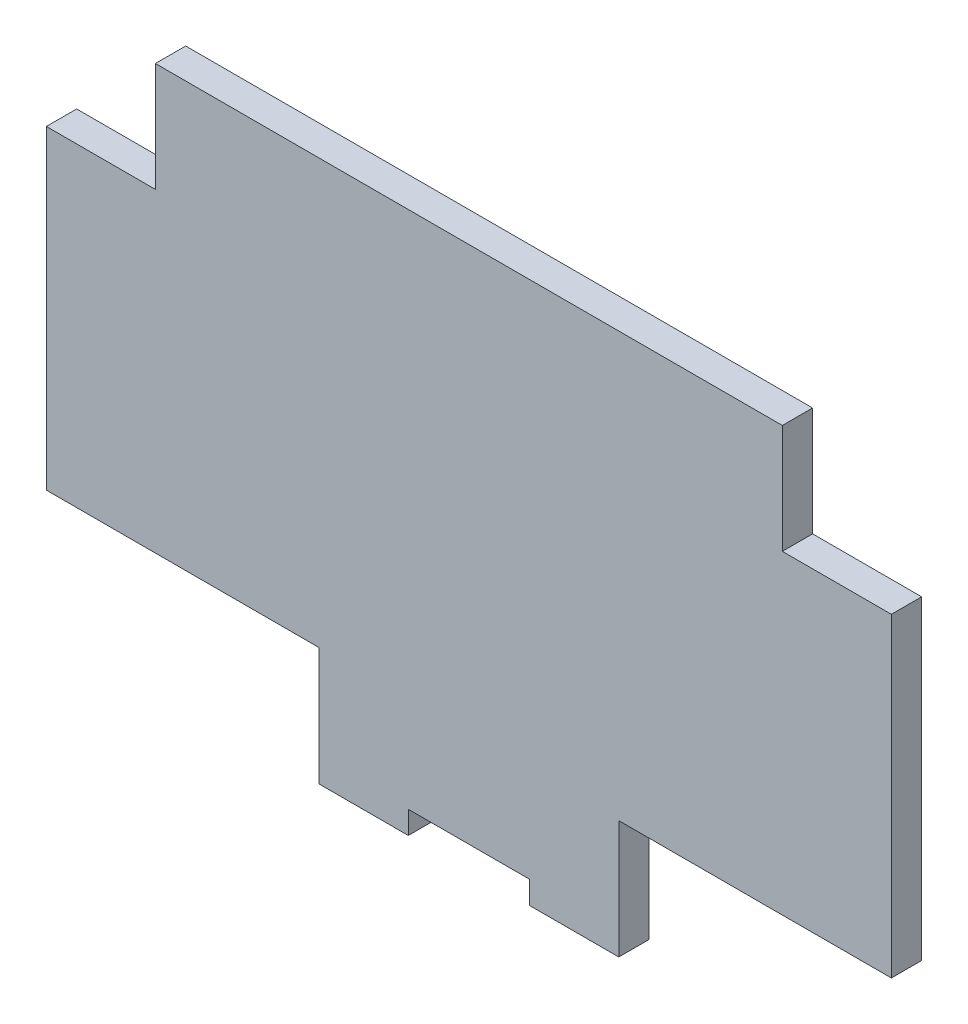
ISO-10303-21;
HEADER;
FILE_DESCRIPTION(('STEP AP214'),'2;1');
FILE_NAME('part.step','',(''),(''),'','','');
FILE_SCHEMA(('AUTOMOTIVE_DESIGN { 1 0 10303 214 1 1 1 1 }'));
ENDSEC;
DATA;
#1=APPLICATION_CONTEXT('core data for automotive mechanical design processes');
#2=APPLICATION_PROTOCOL_DEFINITION('international standard','automotive_design',2000,#1);
#3=PRODUCT_CONTEXT('',#1,'mechanical');
#4=PRODUCT('Part','Part','',(#3));
#5=PRODUCT_RELATED_PRODUCT_CATEGORY('part','',(#4));
#6=PRODUCT_DEFINITION_FORMATION('','',#4);
#7=PRODUCT_DEFINITION_CONTEXT('part definition',#1,'design');
#8=PRODUCT_DEFINITION('design','',#6,#7);
#9=PRODUCT_DEFINITION_SHAPE('','',#8);
#10=(LENGTH_UNIT() NAMED_UNIT(*) SI_UNIT(.MILLI.,.METRE.));
#11=(NAMED_UNIT(*) PLANE_ANGLE_UNIT() SI_UNIT($,.RADIAN.));
#12=(NAMED_UNIT(*) SI_UNIT($,.STERADIAN.) SOLID_ANGLE_UNIT());
#13=UNCERTAINTY_MEASURE_WITH_UNIT(LENGTH_MEASURE(1.E-05),#10,'distance_accuracy_value','');
#14=(GEOMETRIC_REPRESENTATION_CONTEXT(3) GLOBAL_UNCERTAINTY_ASSIGNED_CONTEXT((#13)) GLOBAL_UNIT_ASSIGNED_CONTEXT((#10,
#11,#12)) REPRESENTATION_CONTEXT('',''));
#15=CARTESIAN_POINT('',(0.,0.,0.));
#16=DIRECTION('',(0.,0.,1.));
#17=DIRECTION('',(1.,0.,0.));
#18=AXIS2_PLACEMENT_3D('',#15,#16,#17);
#19=CARTESIAN_POINT('',(0.,0.,-2.));
#20=DIRECTION('',(0.,0.,1.));
#21=DIRECTION('',(1.,0.,0.));
#22=AXIS2_PLACEMENT_3D('',#19,#20,#21);
#23=PLANE('',#22);
#24=DIRECTION('',(1.,0.,0.));
#25=VECTOR('',#24,1.);
#26=CARTESIAN_POINT('',(0.,-17.9,-2.));
#27=LINE('',#26,#25);
#28=CARTESIAN_POINT('',(4.,-17.9,-2.));
#29=VERTEX_POINT('',#28);
#30=CARTESIAN_POINT('',(9.89999999999998,-17.9,-2.));
#31=VERTEX_POINT('',#30);
#32=EDGE_CURVE('E203',#29,#31,#27,.T.);
#33=ORIENTED_EDGE('',*,*,#32,.F.);
#34=DIRECTION('',(0.,1.,0.));
#35=VECTOR('',#34,1.);
#36=CARTESIAN_POINT('',(4.,0.,-2.));
#37=LINE('',#36,#35);
#38=CARTESIAN_POINT('',(4.,-16.4,-2.));
#39=VERTEX_POINT('',#38);
#40=EDGE_CURVE('E247',#29,#39,#37,.T.);
#41=ORIENTED_EDGE('',*,*,#40,.T.);
#42=DIRECTION('',(1.,0.,0.));
#43=VECTOR('',#42,1.);
#44=CARTESIAN_POINT('',(0.,-16.4,-2.));
#45=LINE('',#44,#43);
#46=CARTESIAN_POINT('',(-4.,-16.4,-2.));
#47=VERTEX_POINT('',#46);
#48=EDGE_CURVE('E244',#47,#39,#45,.T.);
#49=ORIENTED_EDGE('',*,*,#48,.F.);
#50=DIRECTION('',(0.,1.,0.));
#51=VECTOR('',#50,1.);
#52=CARTESIAN_POINT('',(-4.,0.,-2.));
#53=LINE('',#52,#51);
#54=CARTESIAN_POINT('',(-4.,-17.9,-2.));
#55=VERTEX_POINT('',#54);
#56=EDGE_CURVE('E241',#55,#47,#53,.T.);
#57=ORIENTED_EDGE('',*,*,#56,.F.);
#58=CARTESIAN_POINT('',(-9.90000000000001,-17.9,-2.));
#59=VERTEX_POINT('',#58);
#60=EDGE_CURVE('E208',#59,#55,#27,.T.);
#61=ORIENTED_EDGE('',*,*,#60,.F.);
#62=DIRECTION('',(0.,-1.,0.));
#63=VECTOR('',#62,1.);
#64=CARTESIAN_POINT('',(-9.90000000000001,0.,-2.));
#65=LINE('',#64,#63);
#66=CARTESIAN_POINT('',(-9.90000000000001,-10.1,-2.));
#67=VERTEX_POINT('',#66);
#68=EDGE_CURVE('E238',#67,#59,#65,.T.);
#69=ORIENTED_EDGE('',*,*,#68,.F.);
#70=DIRECTION('',(1.,0.,0.));
#71=VECTOR('',#70,1.);
#72=CARTESIAN_POINT('',(0.,-10.1,-2.));
#73=LINE('',#72,#71);
#74=CARTESIAN_POINT('',(-27.9,-10.1,-2.));
#75=VERTEX_POINT('',#74);
#76=EDGE_CURVE('E235',#75,#67,#73,.T.);
#77=ORIENTED_EDGE('',*,*,#76,.F.);
#78=DIRECTION('',(0.,-1.,0.));
#79=VECTOR('',#78,1.);
#80=CARTESIAN_POINT('',(-27.9,0.,-2.));
#81=LINE('',#80,#79);
#82=CARTESIAN_POINT('',(-27.9,10.7,-2.));
#83=VERTEX_POINT('',#82);
#84=EDGE_CURVE('E232',#83,#75,#81,.T.);
#85=ORIENTED_EDGE('',*,*,#84,.F.);
#86=DIRECTION('',(-1.,0.,0.));
#87=VECTOR('',#86,1.);
#88=CARTESIAN_POINT('',(0.,10.7,-2.));
#89=LINE('',#88,#87);
#90=CARTESIAN_POINT('',(-20.7,10.7,-2.));
#91=VERTEX_POINT('',#90);
#92=EDGE_CURVE('E229',#91,#83,#89,.T.);
#93=ORIENTED_EDGE('',*,*,#92,.F.);
#94=DIRECTION('',(0.,-1.,0.));
#95=VECTOR('',#94,1.);
#96=CARTESIAN_POINT('',(-20.7,0.,-2.));
#97=LINE('',#96,#95);
#98=CARTESIAN_POINT('',(-20.7,17.9,-2.));
#99=VERTEX_POINT('',#98);
#100=EDGE_CURVE('E226',#99,#91,#97,.T.);
#101=ORIENTED_EDGE('',*,*,#100,.F.);
#102=DIRECTION('',(-1.,0.,0.));
#103=VECTOR('',#102,1.);
#104=CARTESIAN_POINT('',(0.,17.9,-2.));
#105=LINE('',#104,#103);
#106=CARTESIAN_POINT('',(20.7,17.9,-2.));
#107=VERTEX_POINT('',#106);
#108=EDGE_CURVE('E223',#107,#99,#105,.T.);
#109=ORIENTED_EDGE('',*,*,#108,.F.);
#110=DIRECTION('',(0.,1.,0.));
#111=VECTOR('',#110,1.);
#112=CARTESIAN_POINT('',(20.7,0.,-2.));
#113=LINE('',#112,#111);
#114=CARTESIAN_POINT('',(20.7,10.7,-2.));
#115=VERTEX_POINT('',#114);
#116=EDGE_CURVE('E220',#115,#107,#113,.T.);
#117=ORIENTED_EDGE('',*,*,#116,.F.);
#118=DIRECTION('',(-1.,0.,0.));
#119=VECTOR('',#118,1.);
#120=CARTESIAN_POINT('',(0.,10.7,-2.));
#121=LINE('',#120,#119);
#122=CARTESIAN_POINT('',(27.9,10.7,-2.));
#123=VERTEX_POINT('',#122);
#124=EDGE_CURVE('E217',#123,#115,#121,.T.);
#125=ORIENTED_EDGE('',*,*,#124,.F.);
#126=DIRECTION('',(0.,1.,0.));
#127=VECTOR('',#126,1.);
#128=CARTESIAN_POINT('',(27.9,0.,-2.));
#129=LINE('',#128,#127);
#130=CARTESIAN_POINT('',(27.9,-10.1,-2.));
#131=VERTEX_POINT('',#130);
#132=EDGE_CURVE('E214',#131,#123,#129,.T.);
#133=ORIENTED_EDGE('',*,*,#132,.F.);
#134=DIRECTION('',(1.,0.,0.));
#135=VECTOR('',#134,1.);
#136=CARTESIAN_POINT('',(0.,-10.1,-2.));
#137=LINE('',#136,#135);
#138=CARTESIAN_POINT('',(9.89999999999998,-10.1,-2.));
#139=VERTEX_POINT('',#138);
#140=EDGE_CURVE('E211',#139,#131,#137,.T.);
#141=ORIENTED_EDGE('',*,*,#140,.F.);
#142=DIRECTION('',(0.,1.,0.));
#143=VECTOR('',#142,1.);
#144=CARTESIAN_POINT('',(9.89999999999999,0.,-2.));
#145=LINE('',#144,#143);
#146=EDGE_CURVE('E206',#31,#139,#145,.T.);
#147=ORIENTED_EDGE('',*,*,#146,.F.);
#148=EDGE_LOOP('',(#33,#41,#49,#57,#61,#69,#77,#85,#93,#101,#109,#117,#125,#133,#141,#147));
#149=FACE_BOUND('',#148,.T.);
#150=DIRECTION('',(0.,1.,0.));
#151=VECTOR('',#150,1.);
#152=CARTESIAN_POINT('',(-20.,-8.2,-2.));
#153=LINE('',#152,#151);
#154=CARTESIAN_POINT('',(-20.,-8.2,-2.));
#155=VERTEX_POINT('',#154);
#156=CARTESIAN_POINT('',(-20.,4.8,-2.));
#157=VERTEX_POINT('',#156);
#158=EDGE_CURVE('E52',#155,#157,#153,.T.);
#159=ORIENTED_EDGE('',*,*,#158,.F.);
#160=DIRECTION('',(-1.,0.,0.));
#161=VECTOR('',#160,1.);
#162=CARTESIAN_POINT('',(20.,-8.2,-2.));
#163=LINE('',#162,#161);
#164=CARTESIAN_POINT('',(20.,-8.2,-2.));
#165=VERTEX_POINT('',#164);
#166=EDGE_CURVE('E56',#165,#155,#163,.T.);
#167=ORIENTED_EDGE('',*,*,#166,.F.);
#168=DIRECTION('',(0.,-1.,0.));
#169=VECTOR('',#168,1.);
#170=CARTESIAN_POINT('',(20.,-8.2,-2.));
#171=LINE('',#170,#169);
#172=CARTESIAN_POINT('',(20.,4.8,-2.));
#173=VERTEX_POINT('',#172);
#174=EDGE_CURVE('E533',#173,#165,#171,.T.);
#175=ORIENTED_EDGE('',*,*,#174,.F.);
#176=DIRECTION('',(1.,0.,0.));
#177=VECTOR('',#176,1.);
#178=CARTESIAN_POINT('',(20.,4.8,-2.));
#179=LINE('',#178,#177);
#180=EDGE_CURVE('E539',#157,#173,#179,.T.);
#181=ORIENTED_EDGE('',*,*,#180,.F.);
#182=EDGE_LOOP('',(#159,#167,#175,#181));
#183=FACE_BOUND('',#182,.T.);
#184=ADVANCED_FACE('F35',(#149,#183),#23,.F.);
#185=CARTESIAN_POINT('',(0.,-17.9,-2.));
#186=DIRECTION('',(0.,-1.,0.));
#187=DIRECTION('',(0.,0.,-1.));
#188=AXIS2_PLACEMENT_3D('',#185,#186,#187);
#189=PLANE('',#188);
#190=DIRECTION('',(1.,0.,0.));
#191=VECTOR('',#190,1.);
#192=CARTESIAN_POINT('',(0.,-17.9,0.));
#193=LINE('',#192,#191);
#194=CARTESIAN_POINT('',(4.,-17.9,0.));
#195=VERTEX_POINT('',#194);
#196=CARTESIAN_POINT('',(9.89999999999998,-17.9,0.));
#197=VERTEX_POINT('',#196);
#198=EDGE_CURVE('E193',#195,#197,#193,.T.);
#199=ORIENTED_EDGE('',*,*,#198,.F.);
#200=DIRECTION('',(0.,0.,1.));
#201=VECTOR('',#200,1.);
#202=CARTESIAN_POINT('',(4.,-17.9,-2.));
#203=LINE('',#202,#201);
#204=EDGE_CURVE('E11',#29,#195,#203,.T.);
#205=ORIENTED_EDGE('',*,*,#204,.F.);
#206=ORIENTED_EDGE('',*,*,#32,.T.);
#207=DIRECTION('',(0.,0.,1.));
#208=VECTOR('',#207,1.);
#209=CARTESIAN_POINT('',(9.89999999999998,-17.9,-2.));
#210=LINE('',#209,#208);
#211=EDGE_CURVE('E39',#31,#197,#210,.T.);
#212=ORIENTED_EDGE('',*,*,#211,.T.);
#213=EDGE_LOOP('',(#199,#205,#206,#212));
#214=FACE_BOUND('',#213,.T.);
#215=ADVANCED_FACE('F319',(#214),#189,.T.);
#216=CARTESIAN_POINT('',(4.,0.,-2.));
#217=DIRECTION('',(1.,0.,0.));
#218=DIRECTION('',(0.,0.,-1.));
#219=AXIS2_PLACEMENT_3D('',#216,#217,#218);
#220=PLANE('',#219);
#221=DIRECTION('',(0.,1.,0.));
#222=VECTOR('',#221,1.);
#223=CARTESIAN_POINT('',(4.,0.,0.));
#224=LINE('',#223,#222);
#225=CARTESIAN_POINT('',(4.,-16.4,0.));
#226=VERTEX_POINT('',#225);
#227=EDGE_CURVE('E207',#195,#226,#224,.T.);
#228=ORIENTED_EDGE('',*,*,#227,.T.);
#229=DIRECTION('',(0.,0.,1.));
#230=VECTOR('',#229,1.);
#231=CARTESIAN_POINT('',(4.,-16.4,-2.));
#232=LINE('',#231,#230);
#233=EDGE_CURVE('E44',#39,#226,#232,.T.);
#234=ORIENTED_EDGE('',*,*,#233,.F.);
#235=ORIENTED_EDGE('',*,*,#40,.F.);
#236=ORIENTED_EDGE('',*,*,#204,.T.);
#237=EDGE_LOOP('',(#228,#234,#235,#236));
#238=FACE_BOUND('',#237,.T.);
#239=ADVANCED_FACE('F328',(#238),#220,.F.);
#240=CARTESIAN_POINT('',(0.,-16.4,-2.));
#241=DIRECTION('',(0.,-1.,0.));
#242=DIRECTION('',(0.,0.,-1.));
#243=AXIS2_PLACEMENT_3D('',#240,#241,#242);
#244=PLANE('',#243);
#245=DIRECTION('',(1.,0.,0.));
#246=VECTOR('',#245,1.);
#247=CARTESIAN_POINT('',(0.,-16.4,0.));
#248=LINE('',#247,#246);
#249=CARTESIAN_POINT('',(-4.,-16.4,0.));
#250=VERTEX_POINT('',#249);
#251=EDGE_CURVE('E284',#250,#226,#248,.T.);
#252=ORIENTED_EDGE('',*,*,#251,.F.);
#253=DIRECTION('',(0.,0.,1.));
#254=VECTOR('',#253,1.);
#255=CARTESIAN_POINT('',(-4.,-16.4,-2.));
#256=LINE('',#255,#254);
#257=EDGE_CURVE('E290',#47,#250,#256,.T.);
#258=ORIENTED_EDGE('',*,*,#257,.F.);
#259=ORIENTED_EDGE('',*,*,#48,.T.);
#260=ORIENTED_EDGE('',*,*,#233,.T.);
#261=EDGE_LOOP('',(#252,#258,#259,#260));
#262=FACE_BOUND('',#261,.T.);
#263=ADVANCED_FACE('F382',(#262),#244,.T.);
#264=CARTESIAN_POINT('',(-4.,0.,-2.));
#265=DIRECTION('',(1.,0.,0.));
#266=DIRECTION('',(0.,0.,-1.));
#267=AXIS2_PLACEMENT_3D('',#264,#265,#266);
#268=PLANE('',#267);
#269=DIRECTION('',(0.,1.,0.));
#270=VECTOR('',#269,1.);
#271=CARTESIAN_POINT('',(-4.,0.,0.));
#272=LINE('',#271,#270);
#273=CARTESIAN_POINT('',(-4.,-17.9,0.));
#274=VERTEX_POINT('',#273);
#275=EDGE_CURVE('E281',#274,#250,#272,.T.);
#276=ORIENTED_EDGE('',*,*,#275,.F.);
#277=DIRECTION('',(0.,0.,1.));
#278=VECTOR('',#277,1.);
#279=CARTESIAN_POINT('',(-4.,-17.9,-2.));
#280=LINE('',#279,#278);
#281=EDGE_CURVE('E292',#55,#274,#280,.T.);
#282=ORIENTED_EDGE('',*,*,#281,.F.);
#283=ORIENTED_EDGE('',*,*,#56,.T.);
#284=ORIENTED_EDGE('',*,*,#257,.T.);
#285=EDGE_LOOP('',(#276,#282,#283,#284));
#286=FACE_BOUND('',#285,.T.);
#287=ADVANCED_FACE('F380',(#286),#268,.T.);
#288=CARTESIAN_POINT('',(-9.90000000000001,-17.9,0.));
#289=VERTEX_POINT('',#288);
#290=EDGE_CURVE('E198',#289,#274,#193,.T.);
#291=ORIENTED_EDGE('',*,*,#290,.F.);
#292=DIRECTION('',(0.,0.,1.));
#293=VECTOR('',#292,1.);
#294=CARTESIAN_POINT('',(-9.90000000000001,-17.9,-2.));
#295=LINE('',#294,#293);
#296=EDGE_CURVE('E294',#59,#289,#295,.T.);
#297=ORIENTED_EDGE('',*,*,#296,.F.);
#298=ORIENTED_EDGE('',*,*,#60,.T.);
#299=ORIENTED_EDGE('',*,*,#281,.T.);
#300=EDGE_LOOP('',(#291,#297,#298,#299));
#301=FACE_BOUND('',#300,.T.);
#302=ADVANCED_FACE('F375',(#301),#189,.T.);
#303=CARTESIAN_POINT('',(-9.90000000000001,0.,-2.));
#304=DIRECTION('',(-1.,0.,0.));
#305=DIRECTION('',(0.,0.,1.));
#306=AXIS2_PLACEMENT_3D('',#303,#304,#305);
#307=PLANE('',#306);
#308=DIRECTION('',(0.,-1.,0.));
#309=VECTOR('',#308,1.);
#310=CARTESIAN_POINT('',(-9.90000000000001,0.,0.));
#311=LINE('',#310,#309);
#312=CARTESIAN_POINT('',(-9.90000000000001,-10.1,0.));
#313=VERTEX_POINT('',#312);
#314=EDGE_CURVE('E278',#313,#289,#311,.T.);
#315=ORIENTED_EDGE('',*,*,#314,.F.);
#316=DIRECTION('',(0.,0.,1.));
#317=VECTOR('',#316,1.);
#318=CARTESIAN_POINT('',(-9.90000000000001,-10.1,-2.));
#319=LINE('',#318,#317);
#320=EDGE_CURVE('E296',#67,#313,#319,.T.);
#321=ORIENTED_EDGE('',*,*,#320,.F.);
#322=ORIENTED_EDGE('',*,*,#68,.T.);
#323=ORIENTED_EDGE('',*,*,#296,.T.);
#324=EDGE_LOOP('',(#315,#321,#322,#323));
#325=FACE_BOUND('',#324,.T.);
#326=ADVANCED_FACE('F370',(#325),#307,.T.);
#327=CARTESIAN_POINT('',(0.,-10.1,-2.));
#328=DIRECTION('',(0.,-1.,0.));
#329=DIRECTION('',(0.,0.,-1.));
#330=AXIS2_PLACEMENT_3D('',#327,#328,#329);
#331=PLANE('',#330);
#332=DIRECTION('',(1.,0.,0.));
#333=VECTOR('',#332,1.);
#334=CARTESIAN_POINT('',(0.,-10.1,0.));
#335=LINE('',#334,#333);
#336=CARTESIAN_POINT('',(-27.9,-10.1,0.));
#337=VERTEX_POINT('',#336);
#338=EDGE_CURVE('E275',#337,#313,#335,.T.);
#339=ORIENTED_EDGE('',*,*,#338,.F.);
#340=DIRECTION('',(0.,0.,1.));
#341=VECTOR('',#340,1.);
#342=CARTESIAN_POINT('',(-27.9,-10.1,-2.));
#343=LINE('',#342,#341);
#344=EDGE_CURVE('E298',#75,#337,#343,.T.);
#345=ORIENTED_EDGE('',*,*,#344,.F.);
#346=ORIENTED_EDGE('',*,*,#76,.T.);
#347=ORIENTED_EDGE('',*,*,#320,.T.);
#348=EDGE_LOOP('',(#339,#345,#346,#347));
#349=FACE_BOUND('',#348,.T.);
#350=ADVANCED_FACE('F366',(#349),#331,.T.);
#351=CARTESIAN_POINT('',(-27.9,0.,-2.));
#352=DIRECTION('',(-1.,0.,0.));
#353=DIRECTION('',(0.,0.,1.));
#354=AXIS2_PLACEMENT_3D('',#351,#352,#353);
#355=PLANE('',#354);
#356=DIRECTION('',(0.,-1.,0.));
#357=VECTOR('',#356,1.);
#358=CARTESIAN_POINT('',(-27.9,0.,0.));
#359=LINE('',#358,#357);
#360=CARTESIAN_POINT('',(-27.9,10.7,0.));
#361=VERTEX_POINT('',#360);
#362=EDGE_CURVE('E272',#361,#337,#359,.T.);
#363=ORIENTED_EDGE('',*,*,#362,.F.);
#364=DIRECTION('',(0.,0.,1.));
#365=VECTOR('',#364,1.);
#366=CARTESIAN_POINT('',(-27.9,10.7,-2.));
#367=LINE('',#366,#365);
#368=EDGE_CURVE('E300',#83,#361,#367,.T.);
#369=ORIENTED_EDGE('',*,*,#368,.F.);
#370=ORIENTED_EDGE('',*,*,#84,.T.);
#371=ORIENTED_EDGE('',*,*,#344,.T.);
#372=EDGE_LOOP('',(#363,#369,#370,#371));
#373=FACE_BOUND('',#372,.T.);
#374=ADVANCED_FACE('F362',(#373),#355,.T.);
#375=CARTESIAN_POINT('',(0.,10.7,-2.));
#376=DIRECTION('',(0.,1.,0.));
#377=DIRECTION('',(0.,0.,1.));
#378=AXIS2_PLACEMENT_3D('',#375,#376,#377);
#379=PLANE('',#378);
#380=DIRECTION('',(-1.,0.,0.));
#381=VECTOR('',#380,1.);
#382=CARTESIAN_POINT('',(0.,10.7,0.));
#383=LINE('',#382,#381);
#384=CARTESIAN_POINT('',(-20.7,10.7,0.));
#385=VERTEX_POINT('',#384);
#386=EDGE_CURVE('E269',#385,#361,#383,.T.);
#387=ORIENTED_EDGE('',*,*,#386,.F.);
#388=DIRECTION('',(0.,0.,1.));
#389=VECTOR('',#388,1.);
#390=CARTESIAN_POINT('',(-20.7,10.7,-2.));
#391=LINE('',#390,#389);
#392=EDGE_CURVE('E302',#91,#385,#391,.T.);
#393=ORIENTED_EDGE('',*,*,#392,.F.);
#394=ORIENTED_EDGE('',*,*,#92,.T.);
#395=ORIENTED_EDGE('',*,*,#368,.T.);
#396=EDGE_LOOP('',(#387,#393,#394,#395));
#397=FACE_BOUND('',#396,.T.);
#398=ADVANCED_FACE('F358',(#397),#379,.T.);
#399=CARTESIAN_POINT('',(-20.7,0.,-2.));
#400=DIRECTION('',(-1.,0.,0.));
#401=DIRECTION('',(0.,0.,1.));
#402=AXIS2_PLACEMENT_3D('',#399,#400,#401);
#403=PLANE('',#402);
#404=DIRECTION('',(0.,-1.,0.));
#405=VECTOR('',#404,1.);
#406=CARTESIAN_POINT('',(-20.7,0.,0.));
#407=LINE('',#406,#405);
#408=CARTESIAN_POINT('',(-20.7,17.9,0.));
#409=VERTEX_POINT('',#408);
#410=EDGE_CURVE('E266',#409,#385,#407,.T.);
#411=ORIENTED_EDGE('',*,*,#410,.F.);
#412=DIRECTION('',(0.,0.,1.));
#413=VECTOR('',#412,1.);
#414=CARTESIAN_POINT('',(-20.7,17.9,-2.));
#415=LINE('',#414,#413);
#416=EDGE_CURVE('E304',#99,#409,#415,.T.);
#417=ORIENTED_EDGE('',*,*,#416,.F.);
#418=ORIENTED_EDGE('',*,*,#100,.T.);
#419=ORIENTED_EDGE('',*,*,#392,.T.);
#420=EDGE_LOOP('',(#411,#417,#418,#419));
#421=FACE_BOUND('',#420,.T.);
#422=ADVANCED_FACE('F354',(#421),#403,.T.);
#423=CARTESIAN_POINT('',(0.,17.9,-2.));
#424=DIRECTION('',(0.,1.,0.));
#425=DIRECTION('',(-1.,0.,0.));
#426=AXIS2_PLACEMENT_3D('',#423,#424,#425);
#427=PLANE('',#426);
#428=DIRECTION('',(-1.,0.,0.));
#429=VECTOR('',#428,1.);
#430=CARTESIAN_POINT('',(0.,17.9,0.));
#431=LINE('',#430,#429);
#432=CARTESIAN_POINT('',(20.7,17.9,0.));
#433=VERTEX_POINT('',#432);
#434=EDGE_CURVE('E263',#433,#409,#431,.T.);
#435=ORIENTED_EDGE('',*,*,#434,.F.);
#436=DIRECTION('',(0.,0.,1.));
#437=VECTOR('',#436,1.);
#438=CARTESIAN_POINT('',(20.7,17.9,-2.));
#439=LINE('',#438,#437);
#440=EDGE_CURVE('E306',#107,#433,#439,.T.);
#441=ORIENTED_EDGE('',*,*,#440,.F.);
#442=ORIENTED_EDGE('',*,*,#108,.T.);
#443=ORIENTED_EDGE('',*,*,#416,.T.);
#444=EDGE_LOOP('',(#435,#441,#442,#443));
#445=FACE_BOUND('',#444,.T.);
#446=ADVANCED_FACE('F350',(#445),#427,.T.);
#447=CARTESIAN_POINT('',(20.7,0.,-2.));
#448=DIRECTION('',(1.,0.,0.));
#449=DIRECTION('',(0.,0.,-1.));
#450=AXIS2_PLACEMENT_3D('',#447,#448,#449);
#451=PLANE('',#450);
#452=DIRECTION('',(0.,1.,0.));
#453=VECTOR('',#452,1.);
#454=CARTESIAN_POINT('',(20.7,0.,0.));
#455=LINE('',#454,#453);
#456=CARTESIAN_POINT('',(20.7,10.7,0.));
#457=VERTEX_POINT('',#456);
#458=EDGE_CURVE('E260',#457,#433,#455,.T.);
#459=ORIENTED_EDGE('',*,*,#458,.F.);
#460=DIRECTION('',(0.,0.,1.));
#461=VECTOR('',#460,1.);
#462=CARTESIAN_POINT('',(20.7,10.7,-2.));
#463=LINE('',#462,#461);
#464=EDGE_CURVE('E308',#115,#457,#463,.T.);
#465=ORIENTED_EDGE('',*,*,#464,.F.);
#466=ORIENTED_EDGE('',*,*,#116,.T.);
#467=ORIENTED_EDGE('',*,*,#440,.T.);
#468=EDGE_LOOP('',(#459,#465,#466,#467));
#469=FACE_BOUND('',#468,.T.);
#470=ADVANCED_FACE('F346',(#469),#451,.T.);
#471=CARTESIAN_POINT('',(0.,10.7,-2.));
#472=DIRECTION('',(0.,1.,0.));
#473=DIRECTION('',(0.,0.,1.));
#474=AXIS2_PLACEMENT_3D('',#471,#472,#473);
#475=PLANE('',#474);
#476=DIRECTION('',(-1.,0.,0.));
#477=VECTOR('',#476,1.);
#478=CARTESIAN_POINT('',(0.,10.7,0.));
#479=LINE('',#478,#477);
#480=CARTESIAN_POINT('',(27.9,10.7,0.));
#481=VERTEX_POINT('',#480);
#482=EDGE_CURVE('E257',#481,#457,#479,.T.);
#483=ORIENTED_EDGE('',*,*,#482,.F.);
#484=DIRECTION('',(0.,0.,1.));
#485=VECTOR('',#484,1.);
#486=CARTESIAN_POINT('',(27.9,10.7,-2.));
#487=LINE('',#486,#485);
#488=EDGE_CURVE('E310',#123,#481,#487,.T.);
#489=ORIENTED_EDGE('',*,*,#488,.F.);
#490=ORIENTED_EDGE('',*,*,#124,.T.);
#491=ORIENTED_EDGE('',*,*,#464,.T.);
#492=EDGE_LOOP('',(#483,#489,#490,#491));
#493=FACE_BOUND('',#492,.T.);
#494=ADVANCED_FACE('F342',(#493),#475,.T.);
#495=CARTESIAN_POINT('',(27.9,0.,-2.));
#496=DIRECTION('',(1.,0.,0.));
#497=DIRECTION('',(0.,0.,-1.));
#498=AXIS2_PLACEMENT_3D('',#495,#496,#497);
#499=PLANE('',#498);
#500=DIRECTION('',(0.,1.,0.));
#501=VECTOR('',#500,1.);
#502=CARTESIAN_POINT('',(27.9,0.,0.));
#503=LINE('',#502,#501);
#504=CARTESIAN_POINT('',(27.9,-10.1,0.));
#505=VERTEX_POINT('',#504);
#506=EDGE_CURVE('E254',#505,#481,#503,.T.);
#507=ORIENTED_EDGE('',*,*,#506,.F.);
#508=DIRECTION('',(0.,0.,1.));
#509=VECTOR('',#508,1.);
#510=CARTESIAN_POINT('',(27.9,-10.1,-2.));
#511=LINE('',#510,#509);
#512=EDGE_CURVE('E312',#131,#505,#511,.T.);
#513=ORIENTED_EDGE('',*,*,#512,.F.);
#514=ORIENTED_EDGE('',*,*,#132,.T.);
#515=ORIENTED_EDGE('',*,*,#488,.T.);
#516=EDGE_LOOP('',(#507,#513,#514,#515));
#517=FACE_BOUND('',#516,.T.);
#518=ADVANCED_FACE('F340',(#517),#499,.T.);
#519=CARTESIAN_POINT('',(0.,-10.1,-2.));
#520=DIRECTION('',(0.,-1.,0.));
#521=DIRECTION('',(0.,0.,-1.));
#522=AXIS2_PLACEMENT_3D('',#519,#520,#521);
#523=PLANE('',#522);
#524=DIRECTION('',(1.,0.,0.));
#525=VECTOR('',#524,1.);
#526=CARTESIAN_POINT('',(0.,-10.1,0.));
#527=LINE('',#526,#525);
#528=CARTESIAN_POINT('',(9.89999999999998,-10.1,0.));
#529=VERTEX_POINT('',#528);
#530=EDGE_CURVE('E251',#529,#505,#527,.T.);
#531=ORIENTED_EDGE('',*,*,#530,.F.);
#532=DIRECTION('',(0.,0.,1.));
#533=VECTOR('',#532,1.);
#534=CARTESIAN_POINT('',(9.89999999999998,-10.1,-2.));
#535=LINE('',#534,#533);
#536=EDGE_CURVE('E313',#139,#529,#535,.T.);
#537=ORIENTED_EDGE('',*,*,#536,.F.);
#538=ORIENTED_EDGE('',*,*,#140,.T.);
#539=ORIENTED_EDGE('',*,*,#512,.T.);
#540=EDGE_LOOP('',(#531,#537,#538,#539));
#541=FACE_BOUND('',#540,.T.);
#542=ADVANCED_FACE('F336',(#541),#523,.T.);
#543=CARTESIAN_POINT('',(9.89999999999999,0.,-2.));
#544=DIRECTION('',(1.,0.,0.));
#545=DIRECTION('',(0.,1.,0.));
#546=AXIS2_PLACEMENT_3D('',#543,#544,#545);
#547=PLANE('',#546);
#548=DIRECTION('',(0.,1.,0.));
#549=VECTOR('',#548,1.);
#550=CARTESIAN_POINT('',(9.89999999999999,0.,0.));
#551=LINE('',#550,#549);
#552=EDGE_CURVE('E196',#197,#529,#551,.T.);
#553=ORIENTED_EDGE('',*,*,#552,.F.);
#554=ORIENTED_EDGE('',*,*,#211,.F.);
#555=ORIENTED_EDGE('',*,*,#146,.T.);
#556=ORIENTED_EDGE('',*,*,#536,.T.);
#557=EDGE_LOOP('',(#553,#554,#555,#556));
#558=FACE_BOUND('',#557,.T.);
#559=ADVANCED_FACE('F37',(#558),#547,.T.);
#560=CARTESIAN_POINT('',(0.,0.,0.));
#561=DIRECTION('',(0.,0.,1.));
#562=DIRECTION('',(1.,0.,0.));
#563=AXIS2_PLACEMENT_3D('',#560,#561,#562);
#564=PLANE('',#563);
#565=ORIENTED_EDGE('',*,*,#198,.T.);
#566=ORIENTED_EDGE('',*,*,#552,.T.);
#567=ORIENTED_EDGE('',*,*,#530,.T.);
#568=ORIENTED_EDGE('',*,*,#506,.T.);
#569=ORIENTED_EDGE('',*,*,#482,.T.);
#570=ORIENTED_EDGE('',*,*,#458,.T.);
#571=ORIENTED_EDGE('',*,*,#434,.T.);
#572=ORIENTED_EDGE('',*,*,#410,.T.);
#573=ORIENTED_EDGE('',*,*,#386,.T.);
#574=ORIENTED_EDGE('',*,*,#362,.T.);
#575=ORIENTED_EDGE('',*,*,#338,.T.);
#576=ORIENTED_EDGE('',*,*,#314,.T.);
#577=ORIENTED_EDGE('',*,*,#290,.T.);
#578=ORIENTED_EDGE('',*,*,#275,.T.);
#579=ORIENTED_EDGE('',*,*,#251,.T.);
#580=ORIENTED_EDGE('',*,*,#227,.F.);
#581=EDGE_LOOP('',(#565,#566,#567,#568,#569,#570,#571,#572,#573,#574,#575,#576,#577,#578,#579,#580));
#582=FACE_BOUND('',#581,.T.);
#583=ADVANCED_FACE('F324',(#582),#564,.T.);
#584=CARTESIAN_POINT('',(-20.,-8.2,-4.8));
#585=DIRECTION('',(1.,0.,0.));
#586=DIRECTION('',(0.,0.,-1.));
#587=AXIS2_PLACEMENT_3D('',#584,#585,#586);
#588=PLANE('',#587);
#589=ORIENTED_EDGE('',*,*,#158,.T.);
#590=DIRECTION('',(0.,0.,1.));
#591=VECTOR('',#590,1.);
#592=CARTESIAN_POINT('',(-20.,4.8,-4.8));
#593=LINE('',#592,#591);
#594=CARTESIAN_POINT('',(-20.,4.8,-4.8));
#595=VERTEX_POINT('',#594);
#596=EDGE_CURVE('E176',#595,#157,#593,.T.);
#597=ORIENTED_EDGE('',*,*,#596,.F.);
#598=DIRECTION('',(0.,1.,0.));
#599=VECTOR('',#598,1.);
#600=CARTESIAN_POINT('',(-20.,-8.2,-4.8));
#601=LINE('',#600,#599);
#602=CARTESIAN_POINT('',(-20.,-8.2,-4.8));
#603=VERTEX_POINT('',#602);
#604=EDGE_CURVE('E182',#603,#595,#601,.T.);
#605=ORIENTED_EDGE('',*,*,#604,.F.);
#606=DIRECTION('',(0.,0.,1.));
#607=VECTOR('',#606,1.);
#608=CARTESIAN_POINT('',(-20.,-8.2,-4.8));
#609=LINE('',#608,#607);
#610=EDGE_CURVE('E531',#603,#155,#609,.T.);
#611=ORIENTED_EDGE('',*,*,#610,.T.);
#612=EDGE_LOOP('',(#589,#597,#605,#611));
#613=FACE_BOUND('',#612,.T.);
#614=ADVANCED_FACE('F192',(#613),#588,.F.);
#615=CARTESIAN_POINT('',(20.,4.8,-4.8));
#616=DIRECTION('',(0.,-1.,0.));
#617=DIRECTION('',(0.,0.,-1.));
#618=AXIS2_PLACEMENT_3D('',#615,#616,#617);
#619=PLANE('',#618);
#620=ORIENTED_EDGE('',*,*,#180,.T.);
#621=DIRECTION('',(0.,0.,1.));
#622=VECTOR('',#621,1.);
#623=CARTESIAN_POINT('',(20.,4.8,-4.8));
#624=LINE('',#623,#622);
#625=CARTESIAN_POINT('',(20.,4.8,-4.8));
#626=VERTEX_POINT('',#625);
#627=EDGE_CURVE('E178',#626,#173,#624,.T.);
#628=ORIENTED_EDGE('',*,*,#627,.F.);
#629=DIRECTION('',(1.,0.,0.));
#630=VECTOR('',#629,1.);
#631=CARTESIAN_POINT('',(20.,4.8,-4.8));
#632=LINE('',#631,#630);
#633=EDGE_CURVE('E171',#595,#626,#632,.T.);
#634=ORIENTED_EDGE('',*,*,#633,.F.);
#635=ORIENTED_EDGE('',*,*,#596,.T.);
#636=EDGE_LOOP('',(#620,#628,#634,#635));
#637=FACE_BOUND('',#636,.T.);
#638=ADVANCED_FACE('F174',(#637),#619,.F.);
#639=CARTESIAN_POINT('',(20.,-8.2,-4.8));
#640=DIRECTION('',(-1.,0.,0.));
#641=DIRECTION('',(0.,0.,1.));
#642=AXIS2_PLACEMENT_3D('',#639,#640,#641);
#643=PLANE('',#642);
#644=ORIENTED_EDGE('',*,*,#174,.T.);
#645=DIRECTION('',(0.,0.,1.));
#646=VECTOR('',#645,1.);
#647=CARTESIAN_POINT('',(20.,-8.2,-4.8));
#648=LINE('',#647,#646);
#649=CARTESIAN_POINT('',(20.,-8.2,-4.8));
#650=VERTEX_POINT('',#649);
#651=EDGE_CURVE('E199',#650,#165,#648,.T.);
#652=ORIENTED_EDGE('',*,*,#651,.F.);
#653=DIRECTION('',(0.,-1.,0.));
#654=VECTOR('',#653,1.);
#655=CARTESIAN_POINT('',(20.,-8.2,-4.8));
#656=LINE('',#655,#654);
#657=EDGE_CURVE('E181',#626,#650,#656,.T.);
#658=ORIENTED_EDGE('',*,*,#657,.F.);
#659=ORIENTED_EDGE('',*,*,#627,.T.);
#660=EDGE_LOOP('',(#644,#652,#658,#659));
#661=FACE_BOUND('',#660,.T.);
#662=ADVANCED_FACE('F500',(#661),#643,.F.);
#663=CARTESIAN_POINT('',(20.,-8.2,-4.8));
#664=DIRECTION('',(0.,1.,0.));
#665=DIRECTION('',(0.,0.,1.));
#666=AXIS2_PLACEMENT_3D('',#663,#664,#665);
#667=PLANE('',#666);
#668=ORIENTED_EDGE('',*,*,#166,.T.);
#669=ORIENTED_EDGE('',*,*,#610,.F.);
#670=DIRECTION('',(-1.,0.,0.));
#671=VECTOR('',#670,1.);
#672=CARTESIAN_POINT('',(20.,-8.2,-4.8));
#673=LINE('',#672,#671);
#674=EDGE_CURVE('E187',#650,#603,#673,.T.);
#675=ORIENTED_EDGE('',*,*,#674,.F.);
#676=ORIENTED_EDGE('',*,*,#651,.T.);
#677=EDGE_LOOP('',(#668,#669,#675,#676));
#678=FACE_BOUND('',#677,.T.);
#679=ADVANCED_FACE('F508',(#678),#667,.F.);
#680=CARTESIAN_POINT('',(0.,0.,-4.8));
#681=DIRECTION('',(0.,0.,1.));
#682=DIRECTION('',(1.,0.,0.));
#683=AXIS2_PLACEMENT_3D('',#680,#681,#682);
#684=PLANE('',#683);
#685=ORIENTED_EDGE('',*,*,#604,.T.);
#686=ORIENTED_EDGE('',*,*,#633,.T.);
#687=ORIENTED_EDGE('',*,*,#657,.T.);
#688=ORIENTED_EDGE('',*,*,#674,.T.);
#689=EDGE_LOOP('',(#685,#686,#687,#688));
#690=FACE_BOUND('',#689,.T.);
#691=ADVANCED_FACE('F185',(#690),#684,.F.);
#692=CLOSED_SHELL('',(#184,#215,#239,#263,#287,#302,#326,#350,#374,#398,#422,#446,#470,#494,
#518,#542,#559,#583,#614,#638,#662,#679,#691));
#693=MANIFOLD_SOLID_BREP('B2',#692);
#694=ADVANCED_BREP_SHAPE_REPRESENTATION('',(#18,#693),#14);
#695=SHAPE_DEFINITION_REPRESENTATION(#9,#694);
ENDSEC;
END-ISO-10303-21;
